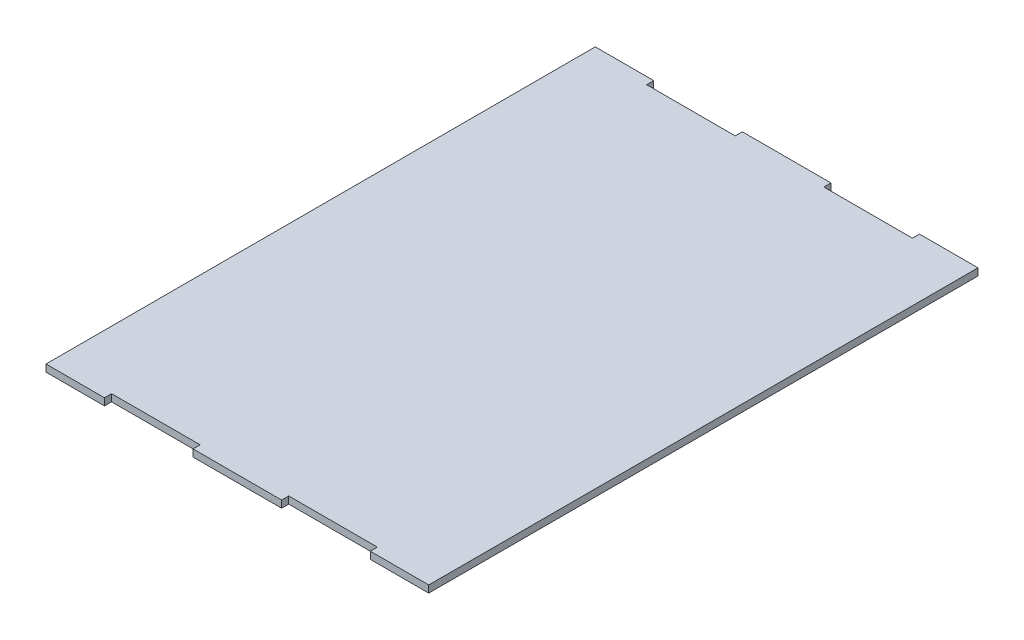
ISO-10303-21;
HEADER;
FILE_DESCRIPTION(('STEP AP214'),'2;1');
FILE_NAME('part.step','',(''),(''),'','','');
FILE_SCHEMA(('AUTOMOTIVE_DESIGN { 1 0 10303 214 1 1 1 1 }'));
ENDSEC;
DATA;
#1=APPLICATION_CONTEXT('core data for automotive mechanical design processes');
#2=APPLICATION_PROTOCOL_DEFINITION('international standard','automotive_design',2000,#1);
#3=PRODUCT_CONTEXT('',#1,'mechanical');
#4=PRODUCT('Part','Part','',(#3));
#5=PRODUCT_RELATED_PRODUCT_CATEGORY('part','',(#4));
#6=PRODUCT_DEFINITION_FORMATION('','',#4);
#7=PRODUCT_DEFINITION_CONTEXT('part definition',#1,'design');
#8=PRODUCT_DEFINITION('design','',#6,#7);
#9=PRODUCT_DEFINITION_SHAPE('','',#8);
#10=(LENGTH_UNIT() NAMED_UNIT(*) SI_UNIT(.MILLI.,.METRE.));
#11=(NAMED_UNIT(*) PLANE_ANGLE_UNIT() SI_UNIT($,.RADIAN.));
#12=(NAMED_UNIT(*) SI_UNIT($,.STERADIAN.) SOLID_ANGLE_UNIT());
#13=UNCERTAINTY_MEASURE_WITH_UNIT(LENGTH_MEASURE(1.E-05),#10,'distance_accuracy_value','');
#14=(GEOMETRIC_REPRESENTATION_CONTEXT(3) GLOBAL_UNCERTAINTY_ASSIGNED_CONTEXT((#13)) GLOBAL_UNIT_ASSIGNED_CONTEXT((#10,
#11,#12)) REPRESENTATION_CONTEXT('',''));
#15=CARTESIAN_POINT('',(0.,0.,0.));
#16=DIRECTION('',(0.,0.,1.));
#17=DIRECTION('',(1.,0.,0.));
#18=AXIS2_PLACEMENT_3D('',#15,#16,#17);
#19=CARTESIAN_POINT('',(108.,4.,155.));
#20=DIRECTION('',(0.,0.,-1.));
#21=DIRECTION('',(-1.,0.,0.));
#22=AXIS2_PLACEMENT_3D('',#19,#20,#21);
#23=PLANE('',#22);
#24=DIRECTION('',(1.,0.,0.));
#25=VECTOR('',#24,1.);
#26=CARTESIAN_POINT('',(108.,0.,155.));
#27=LINE('',#26,#25);
#28=CARTESIAN_POINT('',(-25.,0.,155.));
#29=VERTEX_POINT('',#28);
#30=CARTESIAN_POINT('',(25.,0.,155.));
#31=VERTEX_POINT('',#30);
#32=EDGE_CURVE('E221',#29,#31,#27,.T.);
#33=ORIENTED_EDGE('',*,*,#32,.T.);
#34=DIRECTION('',(0.,1.,0.));
#35=VECTOR('',#34,1.);
#36=CARTESIAN_POINT('',(25.,0.,155.));
#37=LINE('',#36,#35);
#38=CARTESIAN_POINT('',(25.,4.,155.));
#39=VERTEX_POINT('',#38);
#40=EDGE_CURVE('E321',#31,#39,#37,.T.);
#41=ORIENTED_EDGE('',*,*,#40,.T.);
#42=DIRECTION('',(1.,0.,0.));
#43=VECTOR('',#42,1.);
#44=CARTESIAN_POINT('',(108.,4.,155.));
#45=LINE('',#44,#43);
#46=CARTESIAN_POINT('',(-25.,4.,155.));
#47=VERTEX_POINT('',#46);
#48=EDGE_CURVE('E260',#47,#39,#45,.T.);
#49=ORIENTED_EDGE('',*,*,#48,.F.);
#50=DIRECTION('',(0.,1.,0.));
#51=VECTOR('',#50,1.);
#52=CARTESIAN_POINT('',(-25.,0.,155.));
#53=LINE('',#52,#51);
#54=EDGE_CURVE('E270',#29,#47,#53,.T.);
#55=ORIENTED_EDGE('',*,*,#54,.F.);
#56=EDGE_LOOP('',(#33,#41,#49,#55));
#57=FACE_BOUND('',#56,.T.);
#58=ADVANCED_FACE('F39',(#57),#23,.F.);
#59=CARTESIAN_POINT('',(-108.,0.,155.));
#60=VERTEX_POINT('',#59);
#61=CARTESIAN_POINT('',(-75.,0.,155.));
#62=VERTEX_POINT('',#61);
#63=EDGE_CURVE('E217',#60,#62,#27,.T.);
#64=ORIENTED_EDGE('',*,*,#63,.T.);
#65=DIRECTION('',(0.,1.,0.));
#66=VECTOR('',#65,1.);
#67=CARTESIAN_POINT('',(-75.,0.,155.));
#68=LINE('',#67,#66);
#69=CARTESIAN_POINT('',(-75.,4.,155.));
#70=VERTEX_POINT('',#69);
#71=EDGE_CURVE('E267',#62,#70,#68,.T.);
#72=ORIENTED_EDGE('',*,*,#71,.T.);
#73=CARTESIAN_POINT('',(-108.,4.,155.));
#74=VERTEX_POINT('',#73);
#75=EDGE_CURVE('E258',#74,#70,#45,.T.);
#76=ORIENTED_EDGE('',*,*,#75,.F.);
#77=DIRECTION('',(0.,-1.,0.));
#78=VECTOR('',#77,1.);
#79=CARTESIAN_POINT('',(-108.,4.,155.));
#80=LINE('',#79,#78);
#81=EDGE_CURVE('E11',#74,#60,#80,.T.);
#82=ORIENTED_EDGE('',*,*,#81,.T.);
#83=EDGE_LOOP('',(#64,#72,#76,#82));
#84=FACE_BOUND('',#83,.T.);
#85=ADVANCED_FACE('F359',(#84),#23,.F.);
#86=CARTESIAN_POINT('',(108.,4.,-155.));
#87=DIRECTION('',(0.,0.,1.));
#88=DIRECTION('',(1.,0.,0.));
#89=AXIS2_PLACEMENT_3D('',#86,#87,#88);
#90=PLANE('',#89);
#91=DIRECTION('',(-1.,0.,0.));
#92=VECTOR('',#91,1.);
#93=CARTESIAN_POINT('',(108.,4.,-155.));
#94=LINE('',#93,#92);
#95=CARTESIAN_POINT('',(-75.,4.,-155.));
#96=VERTEX_POINT('',#95);
#97=CARTESIAN_POINT('',(-108.,4.,-155.));
#98=VERTEX_POINT('',#97);
#99=EDGE_CURVE('E204',#96,#98,#94,.T.);
#100=ORIENTED_EDGE('',*,*,#99,.F.);
#101=DIRECTION('',(0.,1.,0.));
#102=VECTOR('',#101,1.);
#103=CARTESIAN_POINT('',(-75.,0.,-155.));
#104=LINE('',#103,#102);
#105=CARTESIAN_POINT('',(-75.,0.,-155.));
#106=VERTEX_POINT('',#105);
#107=EDGE_CURVE('E198',#106,#96,#104,.T.);
#108=ORIENTED_EDGE('',*,*,#107,.F.);
#109=DIRECTION('',(-1.,0.,0.));
#110=VECTOR('',#109,1.);
#111=CARTESIAN_POINT('',(108.,0.,-155.));
#112=LINE('',#111,#110);
#113=CARTESIAN_POINT('',(-108.,0.,-155.));
#114=VERTEX_POINT('',#113);
#115=EDGE_CURVE('E223',#106,#114,#112,.T.);
#116=ORIENTED_EDGE('',*,*,#115,.T.);
#117=DIRECTION('',(0.,-1.,0.));
#118=VECTOR('',#117,1.);
#119=CARTESIAN_POINT('',(-108.,4.,-155.));
#120=LINE('',#119,#118);
#121=EDGE_CURVE('E207',#98,#114,#120,.T.);
#122=ORIENTED_EDGE('',*,*,#121,.F.);
#123=EDGE_LOOP('',(#100,#108,#116,#122));
#124=FACE_BOUND('',#123,.T.);
#125=ADVANCED_FACE('F354',(#124),#90,.F.);
#126=CARTESIAN_POINT('',(25.,0.,-155.));
#127=VERTEX_POINT('',#126);
#128=CARTESIAN_POINT('',(-25.,0.,-155.));
#129=VERTEX_POINT('',#128);
#130=EDGE_CURVE('E228',#127,#129,#112,.T.);
#131=ORIENTED_EDGE('',*,*,#130,.T.);
#132=DIRECTION('',(0.,1.,0.));
#133=VECTOR('',#132,1.);
#134=CARTESIAN_POINT('',(-25.,0.,-155.));
#135=LINE('',#134,#133);
#136=CARTESIAN_POINT('',(-25.,4.,-155.));
#137=VERTEX_POINT('',#136);
#138=EDGE_CURVE('E202',#129,#137,#135,.T.);
#139=ORIENTED_EDGE('',*,*,#138,.T.);
#140=CARTESIAN_POINT('',(25.,4.,-155.));
#141=VERTEX_POINT('',#140);
#142=EDGE_CURVE('E194',#141,#137,#94,.T.);
#143=ORIENTED_EDGE('',*,*,#142,.F.);
#144=DIRECTION('',(0.,1.,0.));
#145=VECTOR('',#144,1.);
#146=CARTESIAN_POINT('',(25.,0.,-155.));
#147=LINE('',#146,#145);
#148=EDGE_CURVE('E176',#127,#141,#147,.T.);
#149=ORIENTED_EDGE('',*,*,#148,.F.);
#150=EDGE_LOOP('',(#131,#139,#143,#149));
#151=FACE_BOUND('',#150,.T.);
#152=ADVANCED_FACE('F201',(#151),#90,.F.);
#153=CARTESIAN_POINT('',(-108.,4.,-155.));
#154=DIRECTION('',(1.,0.,0.));
#155=DIRECTION('',(0.,0.,-1.));
#156=AXIS2_PLACEMENT_3D('',#153,#154,#155);
#157=PLANE('',#156);
#158=DIRECTION('',(0.,0.,1.));
#159=VECTOR('',#158,1.);
#160=CARTESIAN_POINT('',(-108.,0.,-155.));
#161=LINE('',#160,#159);
#162=EDGE_CURVE('E212',#114,#60,#161,.T.);
#163=ORIENTED_EDGE('',*,*,#162,.T.);
#164=ORIENTED_EDGE('',*,*,#81,.F.);
#165=DIRECTION('',(0.,0.,1.));
#166=VECTOR('',#165,1.);
#167=CARTESIAN_POINT('',(-108.,4.,-155.));
#168=LINE('',#167,#166);
#169=EDGE_CURVE('E227',#98,#74,#168,.T.);
#170=ORIENTED_EDGE('',*,*,#169,.F.);
#171=ORIENTED_EDGE('',*,*,#121,.T.);
#172=EDGE_LOOP('',(#163,#164,#170,#171));
#173=FACE_BOUND('',#172,.T.);
#174=ADVANCED_FACE('F41',(#173),#157,.F.);
#175=CARTESIAN_POINT('',(75.,4.,155.));
#176=VERTEX_POINT('',#175);
#177=CARTESIAN_POINT('',(108.,4.,155.));
#178=VERTEX_POINT('',#177);
#179=EDGE_CURVE('E257',#176,#178,#45,.T.);
#180=ORIENTED_EDGE('',*,*,#179,.F.);
#181=DIRECTION('',(0.,1.,0.));
#182=VECTOR('',#181,1.);
#183=CARTESIAN_POINT('',(75.,0.,155.));
#184=LINE('',#183,#182);
#185=CARTESIAN_POINT('',(75.,0.,155.));
#186=VERTEX_POINT('',#185);
#187=EDGE_CURVE('E331',#186,#176,#184,.T.);
#188=ORIENTED_EDGE('',*,*,#187,.F.);
#189=CARTESIAN_POINT('',(108.,0.,155.));
#190=VERTEX_POINT('',#189);
#191=EDGE_CURVE('E215',#186,#190,#27,.T.);
#192=ORIENTED_EDGE('',*,*,#191,.T.);
#193=DIRECTION('',(0.,-1.,0.));
#194=VECTOR('',#193,1.);
#195=CARTESIAN_POINT('',(108.,4.,155.));
#196=LINE('',#195,#194);
#197=EDGE_CURVE('E47',#178,#190,#196,.T.);
#198=ORIENTED_EDGE('',*,*,#197,.F.);
#199=EDGE_LOOP('',(#180,#188,#192,#198));
#200=FACE_BOUND('',#199,.T.);
#201=ADVANCED_FACE('F376',(#200),#23,.F.);
#202=CARTESIAN_POINT('',(108.,4.,-155.));
#203=DIRECTION('',(-1.,0.,0.));
#204=DIRECTION('',(0.,0.,1.));
#205=AXIS2_PLACEMENT_3D('',#202,#203,#204);
#206=PLANE('',#205);
#207=DIRECTION('',(0.,0.,-1.));
#208=VECTOR('',#207,1.);
#209=CARTESIAN_POINT('',(108.,0.,-155.));
#210=LINE('',#209,#208);
#211=CARTESIAN_POINT('',(108.,0.,-155.));
#212=VERTEX_POINT('',#211);
#213=EDGE_CURVE('E220',#190,#212,#210,.T.);
#214=ORIENTED_EDGE('',*,*,#213,.T.);
#215=DIRECTION('',(0.,-1.,0.));
#216=VECTOR('',#215,1.);
#217=CARTESIAN_POINT('',(108.,4.,-155.));
#218=LINE('',#217,#216);
#219=CARTESIAN_POINT('',(108.,4.,-155.));
#220=VERTEX_POINT('',#219);
#221=EDGE_CURVE('E231',#220,#212,#218,.T.);
#222=ORIENTED_EDGE('',*,*,#221,.F.);
#223=DIRECTION('',(0.,0.,-1.));
#224=VECTOR('',#223,1.);
#225=CARTESIAN_POINT('',(108.,4.,-155.));
#226=LINE('',#225,#224);
#227=EDGE_CURVE('E208',#178,#220,#226,.T.);
#228=ORIENTED_EDGE('',*,*,#227,.F.);
#229=ORIENTED_EDGE('',*,*,#197,.T.);
#230=EDGE_LOOP('',(#214,#222,#228,#229));
#231=FACE_BOUND('',#230,.T.);
#232=ADVANCED_FACE('F238',(#231),#206,.F.);
#233=CARTESIAN_POINT('',(75.,0.,-155.));
#234=VERTEX_POINT('',#233);
#235=EDGE_CURVE('E224',#212,#234,#112,.T.);
#236=ORIENTED_EDGE('',*,*,#235,.T.);
#237=DIRECTION('',(0.,1.,0.));
#238=VECTOR('',#237,1.);
#239=CARTESIAN_POINT('',(75.,0.,-155.));
#240=LINE('',#239,#238);
#241=CARTESIAN_POINT('',(75.,4.,-155.));
#242=VERTEX_POINT('',#241);
#243=EDGE_CURVE('E187',#234,#242,#240,.T.);
#244=ORIENTED_EDGE('',*,*,#243,.T.);
#245=EDGE_CURVE('E203',#220,#242,#94,.T.);
#246=ORIENTED_EDGE('',*,*,#245,.F.);
#247=ORIENTED_EDGE('',*,*,#221,.T.);
#248=EDGE_LOOP('',(#236,#244,#246,#247));
#249=FACE_BOUND('',#248,.T.);
#250=ADVANCED_FACE('F253',(#249),#90,.F.);
#251=CARTESIAN_POINT('',(0.,4.,0.));
#252=DIRECTION('',(0.,-1.,0.));
#253=DIRECTION('',(0.,0.,-1.));
#254=AXIS2_PLACEMENT_3D('',#251,#252,#253);
#255=PLANE('',#254);
#256=ORIENTED_EDGE('',*,*,#48,.T.);
#257=DIRECTION('',(0.,0.,1.));
#258=VECTOR('',#257,1.);
#259=CARTESIAN_POINT('',(25.,4.,155.));
#260=LINE('',#259,#258);
#261=CARTESIAN_POINT('',(25.,4.,151.));
#262=VERTEX_POINT('',#261);
#263=EDGE_CURVE('E285',#262,#39,#260,.T.);
#264=ORIENTED_EDGE('',*,*,#263,.F.);
#265=DIRECTION('',(-1.,0.,0.));
#266=VECTOR('',#265,1.);
#267=CARTESIAN_POINT('',(25.,4.,151.));
#268=LINE('',#267,#266);
#269=CARTESIAN_POINT('',(75.,4.,151.));
#270=VERTEX_POINT('',#269);
#271=EDGE_CURVE('E317',#270,#262,#268,.T.);
#272=ORIENTED_EDGE('',*,*,#271,.F.);
#273=DIRECTION('',(0.,0.,-1.));
#274=VECTOR('',#273,1.);
#275=CARTESIAN_POINT('',(75.,4.,155.));
#276=LINE('',#275,#274);
#277=EDGE_CURVE('E323',#176,#270,#276,.T.);
#278=ORIENTED_EDGE('',*,*,#277,.F.);
#279=ORIENTED_EDGE('',*,*,#179,.T.);
#280=ORIENTED_EDGE('',*,*,#227,.T.);
#281=ORIENTED_EDGE('',*,*,#245,.T.);
#282=DIRECTION('',(0.,0.,-1.));
#283=VECTOR('',#282,1.);
#284=CARTESIAN_POINT('',(75.,4.,-155.));
#285=LINE('',#284,#283);
#286=CARTESIAN_POINT('',(75.,4.,-151.));
#287=VERTEX_POINT('',#286);
#288=EDGE_CURVE('E255',#287,#242,#285,.T.);
#289=ORIENTED_EDGE('',*,*,#288,.F.);
#290=DIRECTION('',(1.,0.,0.));
#291=VECTOR('',#290,1.);
#292=CARTESIAN_POINT('',(25.,4.,-151.));
#293=LINE('',#292,#291);
#294=CARTESIAN_POINT('',(25.,4.,-151.));
#295=VERTEX_POINT('',#294);
#296=EDGE_CURVE('E197',#295,#287,#293,.T.);
#297=ORIENTED_EDGE('',*,*,#296,.F.);
#298=DIRECTION('',(0.,0.,1.));
#299=VECTOR('',#298,1.);
#300=CARTESIAN_POINT('',(25.,4.,-155.));
#301=LINE('',#300,#299);
#302=EDGE_CURVE('E179',#141,#295,#301,.T.);
#303=ORIENTED_EDGE('',*,*,#302,.F.);
#304=ORIENTED_EDGE('',*,*,#142,.T.);
#305=DIRECTION('',(0.,0.,-1.));
#306=VECTOR('',#305,1.);
#307=CARTESIAN_POINT('',(-25.,4.,-155.));
#308=LINE('',#307,#306);
#309=CARTESIAN_POINT('',(-25.,4.,-151.));
#310=VERTEX_POINT('',#309);
#311=EDGE_CURVE('E296',#310,#137,#308,.T.);
#312=ORIENTED_EDGE('',*,*,#311,.F.);
#313=DIRECTION('',(1.,0.,0.));
#314=VECTOR('',#313,1.);
#315=CARTESIAN_POINT('',(-75.,4.,-151.));
#316=LINE('',#315,#314);
#317=CARTESIAN_POINT('',(-75.,4.,-151.));
#318=VERTEX_POINT('',#317);
#319=EDGE_CURVE('E306',#318,#310,#316,.T.);
#320=ORIENTED_EDGE('',*,*,#319,.F.);
#321=DIRECTION('',(0.,0.,1.));
#322=VECTOR('',#321,1.);
#323=CARTESIAN_POINT('',(-75.,4.,-155.));
#324=LINE('',#323,#322);
#325=EDGE_CURVE('E302',#96,#318,#324,.T.);
#326=ORIENTED_EDGE('',*,*,#325,.F.);
#327=ORIENTED_EDGE('',*,*,#99,.T.);
#328=ORIENTED_EDGE('',*,*,#169,.T.);
#329=ORIENTED_EDGE('',*,*,#75,.T.);
#330=DIRECTION('',(0.,0.,1.));
#331=VECTOR('',#330,1.);
#332=CARTESIAN_POINT('',(-75.,4.,155.));
#333=LINE('',#332,#331);
#334=CARTESIAN_POINT('',(-75.,4.,151.));
#335=VERTEX_POINT('',#334);
#336=EDGE_CURVE('E283',#335,#70,#333,.T.);
#337=ORIENTED_EDGE('',*,*,#336,.F.);
#338=DIRECTION('',(-1.,0.,0.));
#339=VECTOR('',#338,1.);
#340=CARTESIAN_POINT('',(-75.,4.,151.));
#341=LINE('',#340,#339);
#342=CARTESIAN_POINT('',(-25.,4.,151.));
#343=VERTEX_POINT('',#342);
#344=EDGE_CURVE('E276',#343,#335,#341,.T.);
#345=ORIENTED_EDGE('',*,*,#344,.F.);
#346=DIRECTION('',(0.,0.,-1.));
#347=VECTOR('',#346,1.);
#348=CARTESIAN_POINT('',(-25.,4.,155.));
#349=LINE('',#348,#347);
#350=EDGE_CURVE('E280',#47,#343,#349,.T.);
#351=ORIENTED_EDGE('',*,*,#350,.F.);
#352=EDGE_LOOP('',(#256,#264,#272,#278,#279,#280,#281,#289,#297,#303,#304,#312,#320,#326,#327,
#328,#329,#337,#345,#351));
#353=FACE_BOUND('',#352,.T.);
#354=ADVANCED_FACE('F192',(#353),#255,.F.);
#355=CARTESIAN_POINT('',(0.,0.,0.));
#356=DIRECTION('',(0.,-1.,0.));
#357=DIRECTION('',(0.,0.,-1.));
#358=AXIS2_PLACEMENT_3D('',#355,#356,#357);
#359=PLANE('',#358);
#360=DIRECTION('',(0.,0.,1.));
#361=VECTOR('',#360,1.);
#362=CARTESIAN_POINT('',(25.,0.,155.));
#363=LINE('',#362,#361);
#364=CARTESIAN_POINT('',(25.,0.,151.));
#365=VERTEX_POINT('',#364);
#366=EDGE_CURVE('E315',#365,#31,#363,.T.);
#367=ORIENTED_EDGE('',*,*,#366,.T.);
#368=ORIENTED_EDGE('',*,*,#32,.F.);
#369=DIRECTION('',(0.,0.,-1.));
#370=VECTOR('',#369,1.);
#371=CARTESIAN_POINT('',(-25.,0.,155.));
#372=LINE('',#371,#370);
#373=CARTESIAN_POINT('',(-25.,0.,151.));
#374=VERTEX_POINT('',#373);
#375=EDGE_CURVE('E288',#29,#374,#372,.T.);
#376=ORIENTED_EDGE('',*,*,#375,.T.);
#377=DIRECTION('',(-1.,0.,0.));
#378=VECTOR('',#377,1.);
#379=CARTESIAN_POINT('',(-75.,0.,151.));
#380=LINE('',#379,#378);
#381=CARTESIAN_POINT('',(-75.,0.,151.));
#382=VERTEX_POINT('',#381);
#383=EDGE_CURVE('E271',#374,#382,#380,.T.);
#384=ORIENTED_EDGE('',*,*,#383,.T.);
#385=DIRECTION('',(0.,0.,1.));
#386=VECTOR('',#385,1.);
#387=CARTESIAN_POINT('',(-75.,0.,155.));
#388=LINE('',#387,#386);
#389=EDGE_CURVE('E279',#382,#62,#388,.T.);
#390=ORIENTED_EDGE('',*,*,#389,.T.);
#391=ORIENTED_EDGE('',*,*,#63,.F.);
#392=ORIENTED_EDGE('',*,*,#162,.F.);
#393=ORIENTED_EDGE('',*,*,#115,.F.);
#394=DIRECTION('',(0.,0.,1.));
#395=VECTOR('',#394,1.);
#396=CARTESIAN_POINT('',(-75.,0.,-155.));
#397=LINE('',#396,#395);
#398=CARTESIAN_POINT('',(-75.,0.,-151.));
#399=VERTEX_POINT('',#398);
#400=EDGE_CURVE('E293',#106,#399,#397,.T.);
#401=ORIENTED_EDGE('',*,*,#400,.T.);
#402=DIRECTION('',(1.,0.,0.));
#403=VECTOR('',#402,1.);
#404=CARTESIAN_POINT('',(-75.,0.,-151.));
#405=LINE('',#404,#403);
#406=CARTESIAN_POINT('',(-25.,0.,-151.));
#407=VERTEX_POINT('',#406);
#408=EDGE_CURVE('E297',#399,#407,#405,.T.);
#409=ORIENTED_EDGE('',*,*,#408,.T.);
#410=DIRECTION('',(0.,0.,-1.));
#411=VECTOR('',#410,1.);
#412=CARTESIAN_POINT('',(-25.,0.,-155.));
#413=LINE('',#412,#411);
#414=EDGE_CURVE('E62',#407,#129,#413,.T.);
#415=ORIENTED_EDGE('',*,*,#414,.T.);
#416=ORIENTED_EDGE('',*,*,#130,.F.);
#417=DIRECTION('',(0.,0.,1.));
#418=VECTOR('',#417,1.);
#419=CARTESIAN_POINT('',(25.,0.,-155.));
#420=LINE('',#419,#418);
#421=CARTESIAN_POINT('',(25.,0.,-151.));
#422=VERTEX_POINT('',#421);
#423=EDGE_CURVE('E182',#127,#422,#420,.T.);
#424=ORIENTED_EDGE('',*,*,#423,.T.);
#425=DIRECTION('',(1.,0.,0.));
#426=VECTOR('',#425,1.);
#427=CARTESIAN_POINT('',(25.,0.,-151.));
#428=LINE('',#427,#426);
#429=CARTESIAN_POINT('',(75.,0.,-151.));
#430=VERTEX_POINT('',#429);
#431=EDGE_CURVE('E336',#422,#430,#428,.T.);
#432=ORIENTED_EDGE('',*,*,#431,.T.);
#433=DIRECTION('',(0.,0.,-1.));
#434=VECTOR('',#433,1.);
#435=CARTESIAN_POINT('',(75.,0.,-155.));
#436=LINE('',#435,#434);
#437=EDGE_CURVE('E250',#430,#234,#436,.T.);
#438=ORIENTED_EDGE('',*,*,#437,.T.);
#439=ORIENTED_EDGE('',*,*,#235,.F.);
#440=ORIENTED_EDGE('',*,*,#213,.F.);
#441=ORIENTED_EDGE('',*,*,#191,.F.);
#442=DIRECTION('',(0.,0.,-1.));
#443=VECTOR('',#442,1.);
#444=CARTESIAN_POINT('',(75.,0.,155.));
#445=LINE('',#444,#443);
#446=CARTESIAN_POINT('',(75.,0.,151.));
#447=VERTEX_POINT('',#446);
#448=EDGE_CURVE('E318',#186,#447,#445,.T.);
#449=ORIENTED_EDGE('',*,*,#448,.T.);
#450=DIRECTION('',(-1.,0.,0.));
#451=VECTOR('',#450,1.);
#452=CARTESIAN_POINT('',(25.,0.,151.));
#453=LINE('',#452,#451);
#454=EDGE_CURVE('E54',#447,#365,#453,.T.);
#455=ORIENTED_EDGE('',*,*,#454,.T.);
#456=EDGE_LOOP('',(#367,#368,#376,#384,#390,#391,#392,#393,#401,#409,#415,#416,#424,#432,#438,
#439,#440,#441,#449,#455));
#457=FACE_BOUND('',#456,.T.);
#458=ADVANCED_FACE('F246',(#457),#359,.T.);
#459=CARTESIAN_POINT('',(-75.,0.,155.));
#460=DIRECTION('',(-1.,0.,0.));
#461=DIRECTION('',(0.,0.,1.));
#462=AXIS2_PLACEMENT_3D('',#459,#460,#461);
#463=PLANE('',#462);
#464=ORIENTED_EDGE('',*,*,#336,.T.);
#465=ORIENTED_EDGE('',*,*,#71,.F.);
#466=ORIENTED_EDGE('',*,*,#389,.F.);
#467=DIRECTION('',(0.,1.,0.));
#468=VECTOR('',#467,1.);
#469=CARTESIAN_POINT('',(-75.,0.,151.));
#470=LINE('',#469,#468);
#471=EDGE_CURVE('E216',#382,#335,#470,.T.);
#472=ORIENTED_EDGE('',*,*,#471,.T.);
#473=EDGE_LOOP('',(#464,#465,#466,#472));
#474=FACE_BOUND('',#473,.T.);
#475=ADVANCED_FACE('F361',(#474),#463,.F.);
#476=CARTESIAN_POINT('',(-75.,0.,151.));
#477=DIRECTION('',(0.,0.,-1.));
#478=DIRECTION('',(-1.,0.,0.));
#479=AXIS2_PLACEMENT_3D('',#476,#477,#478);
#480=PLANE('',#479);
#481=ORIENTED_EDGE('',*,*,#344,.T.);
#482=ORIENTED_EDGE('',*,*,#471,.F.);
#483=ORIENTED_EDGE('',*,*,#383,.F.);
#484=DIRECTION('',(0.,1.,0.));
#485=VECTOR('',#484,1.);
#486=CARTESIAN_POINT('',(-25.,0.,151.));
#487=LINE('',#486,#485);
#488=EDGE_CURVE('E273',#374,#343,#487,.T.);
#489=ORIENTED_EDGE('',*,*,#488,.T.);
#490=EDGE_LOOP('',(#481,#482,#483,#489));
#491=FACE_BOUND('',#490,.T.);
#492=ADVANCED_FACE('F366',(#491),#480,.F.);
#493=CARTESIAN_POINT('',(-25.,0.,155.));
#494=DIRECTION('',(1.,0.,0.));
#495=DIRECTION('',(0.,0.,-1.));
#496=AXIS2_PLACEMENT_3D('',#493,#494,#495);
#497=PLANE('',#496);
#498=ORIENTED_EDGE('',*,*,#350,.T.);
#499=ORIENTED_EDGE('',*,*,#488,.F.);
#500=ORIENTED_EDGE('',*,*,#375,.F.);
#501=ORIENTED_EDGE('',*,*,#54,.T.);
#502=EDGE_LOOP('',(#498,#499,#500,#501));
#503=FACE_BOUND('',#502,.T.);
#504=ADVANCED_FACE('F369',(#503),#497,.F.);
#505=CARTESIAN_POINT('',(25.,0.,-155.));
#506=DIRECTION('',(-1.,0.,0.));
#507=DIRECTION('',(0.,0.,1.));
#508=AXIS2_PLACEMENT_3D('',#505,#506,#507);
#509=PLANE('',#508);
#510=ORIENTED_EDGE('',*,*,#302,.T.);
#511=DIRECTION('',(0.,1.,0.));
#512=VECTOR('',#511,1.);
#513=CARTESIAN_POINT('',(25.,0.,-151.));
#514=LINE('',#513,#512);
#515=EDGE_CURVE('E338',#422,#295,#514,.T.);
#516=ORIENTED_EDGE('',*,*,#515,.F.);
#517=ORIENTED_EDGE('',*,*,#423,.F.);
#518=ORIENTED_EDGE('',*,*,#148,.T.);
#519=EDGE_LOOP('',(#510,#516,#517,#518));
#520=FACE_BOUND('',#519,.T.);
#521=ADVANCED_FACE('F178',(#520),#509,.F.);
#522=CARTESIAN_POINT('',(75.,0.,-155.));
#523=DIRECTION('',(1.,0.,0.));
#524=DIRECTION('',(0.,0.,-1.));
#525=AXIS2_PLACEMENT_3D('',#522,#523,#524);
#526=PLANE('',#525);
#527=ORIENTED_EDGE('',*,*,#288,.T.);
#528=ORIENTED_EDGE('',*,*,#243,.F.);
#529=ORIENTED_EDGE('',*,*,#437,.F.);
#530=DIRECTION('',(0.,1.,0.));
#531=VECTOR('',#530,1.);
#532=CARTESIAN_POINT('',(75.,0.,-151.));
#533=LINE('',#532,#531);
#534=EDGE_CURVE('E343',#430,#287,#533,.T.);
#535=ORIENTED_EDGE('',*,*,#534,.T.);
#536=EDGE_LOOP('',(#527,#528,#529,#535));
#537=FACE_BOUND('',#536,.T.);
#538=ADVANCED_FACE('F475',(#537),#526,.F.);
#539=CARTESIAN_POINT('',(25.,0.,-151.));
#540=DIRECTION('',(0.,0.,1.));
#541=DIRECTION('',(1.,0.,0.));
#542=AXIS2_PLACEMENT_3D('',#539,#540,#541);
#543=PLANE('',#542);
#544=ORIENTED_EDGE('',*,*,#296,.T.);
#545=ORIENTED_EDGE('',*,*,#534,.F.);
#546=ORIENTED_EDGE('',*,*,#431,.F.);
#547=ORIENTED_EDGE('',*,*,#515,.T.);
#548=EDGE_LOOP('',(#544,#545,#546,#547));
#549=FACE_BOUND('',#548,.T.);
#550=ADVANCED_FACE('F347',(#549),#543,.F.);
#551=CARTESIAN_POINT('',(-75.,0.,-155.));
#552=DIRECTION('',(-1.,0.,0.));
#553=DIRECTION('',(0.,0.,1.));
#554=AXIS2_PLACEMENT_3D('',#551,#552,#553);
#555=PLANE('',#554);
#556=ORIENTED_EDGE('',*,*,#325,.T.);
#557=DIRECTION('',(0.,1.,0.));
#558=VECTOR('',#557,1.);
#559=CARTESIAN_POINT('',(-75.,0.,-151.));
#560=LINE('',#559,#558);
#561=EDGE_CURVE('E301',#399,#318,#560,.T.);
#562=ORIENTED_EDGE('',*,*,#561,.F.);
#563=ORIENTED_EDGE('',*,*,#400,.F.);
#564=ORIENTED_EDGE('',*,*,#107,.T.);
#565=EDGE_LOOP('',(#556,#562,#563,#564));
#566=FACE_BOUND('',#565,.T.);
#567=ADVANCED_FACE('F431',(#566),#555,.F.);
#568=CARTESIAN_POINT('',(-25.,0.,-155.));
#569=DIRECTION('',(1.,0.,0.));
#570=DIRECTION('',(0.,0.,-1.));
#571=AXIS2_PLACEMENT_3D('',#568,#569,#570);
#572=PLANE('',#571);
#573=ORIENTED_EDGE('',*,*,#311,.T.);
#574=ORIENTED_EDGE('',*,*,#138,.F.);
#575=ORIENTED_EDGE('',*,*,#414,.F.);
#576=DIRECTION('',(0.,1.,0.));
#577=VECTOR('',#576,1.);
#578=CARTESIAN_POINT('',(-25.,0.,-151.));
#579=LINE('',#578,#577);
#580=EDGE_CURVE('E312',#407,#310,#579,.T.);
#581=ORIENTED_EDGE('',*,*,#580,.T.);
#582=EDGE_LOOP('',(#573,#574,#575,#581));
#583=FACE_BOUND('',#582,.T.);
#584=ADVANCED_FACE('F392',(#583),#572,.F.);
#585=CARTESIAN_POINT('',(-75.,0.,-151.));
#586=DIRECTION('',(0.,0.,1.));
#587=DIRECTION('',(1.,0.,0.));
#588=AXIS2_PLACEMENT_3D('',#585,#586,#587);
#589=PLANE('',#588);
#590=ORIENTED_EDGE('',*,*,#319,.T.);
#591=ORIENTED_EDGE('',*,*,#580,.F.);
#592=ORIENTED_EDGE('',*,*,#408,.F.);
#593=ORIENTED_EDGE('',*,*,#561,.T.);
#594=EDGE_LOOP('',(#590,#591,#592,#593));
#595=FACE_BOUND('',#594,.T.);
#596=ADVANCED_FACE('F385',(#595),#589,.F.);
#597=CARTESIAN_POINT('',(25.,0.,155.));
#598=DIRECTION('',(-1.,0.,0.));
#599=DIRECTION('',(0.,0.,1.));
#600=AXIS2_PLACEMENT_3D('',#597,#598,#599);
#601=PLANE('',#600);
#602=ORIENTED_EDGE('',*,*,#263,.T.);
#603=ORIENTED_EDGE('',*,*,#40,.F.);
#604=ORIENTED_EDGE('',*,*,#366,.F.);
#605=DIRECTION('',(0.,1.,0.));
#606=VECTOR('',#605,1.);
#607=CARTESIAN_POINT('',(25.,0.,151.));
#608=LINE('',#607,#606);
#609=EDGE_CURVE('E305',#365,#262,#608,.T.);
#610=ORIENTED_EDGE('',*,*,#609,.T.);
#611=EDGE_LOOP('',(#602,#603,#604,#610));
#612=FACE_BOUND('',#611,.T.);
#613=ADVANCED_FACE('F383',(#612),#601,.F.);
#614=CARTESIAN_POINT('',(25.,0.,151.));
#615=DIRECTION('',(0.,0.,-1.));
#616=DIRECTION('',(-1.,0.,0.));
#617=AXIS2_PLACEMENT_3D('',#614,#615,#616);
#618=PLANE('',#617);
#619=ORIENTED_EDGE('',*,*,#271,.T.);
#620=ORIENTED_EDGE('',*,*,#609,.F.);
#621=ORIENTED_EDGE('',*,*,#454,.F.);
#622=DIRECTION('',(0.,1.,0.));
#623=VECTOR('',#622,1.);
#624=CARTESIAN_POINT('',(75.,0.,151.));
#625=LINE('',#624,#623);
#626=EDGE_CURVE('E329',#447,#270,#625,.T.);
#627=ORIENTED_EDGE('',*,*,#626,.T.);
#628=EDGE_LOOP('',(#619,#620,#621,#627));
#629=FACE_BOUND('',#628,.T.);
#630=ADVANCED_FACE('F381',(#629),#618,.F.);
#631=CARTESIAN_POINT('',(75.,0.,155.));
#632=DIRECTION('',(1.,0.,0.));
#633=DIRECTION('',(0.,0.,-1.));
#634=AXIS2_PLACEMENT_3D('',#631,#632,#633);
#635=PLANE('',#634);
#636=ORIENTED_EDGE('',*,*,#277,.T.);
#637=ORIENTED_EDGE('',*,*,#626,.F.);
#638=ORIENTED_EDGE('',*,*,#448,.F.);
#639=ORIENTED_EDGE('',*,*,#187,.T.);
#640=EDGE_LOOP('',(#636,#637,#638,#639));
#641=FACE_BOUND('',#640,.T.);
#642=ADVANCED_FACE('F378',(#641),#635,.F.);
#643=CLOSED_SHELL('',(#58,#85,#125,#152,#174,#201,#232,#250,#354,#458,#475,#492,#504,#521,#538,
#550,#567,#584,#596,#613,#630,#642));
#644=MANIFOLD_SOLID_BREP('B2',#643);
#645=ADVANCED_BREP_SHAPE_REPRESENTATION('',(#18,#644),#14);
#646=SHAPE_DEFINITION_REPRESENTATION(#9,#645);
ENDSEC;
END-ISO-10303-21;
